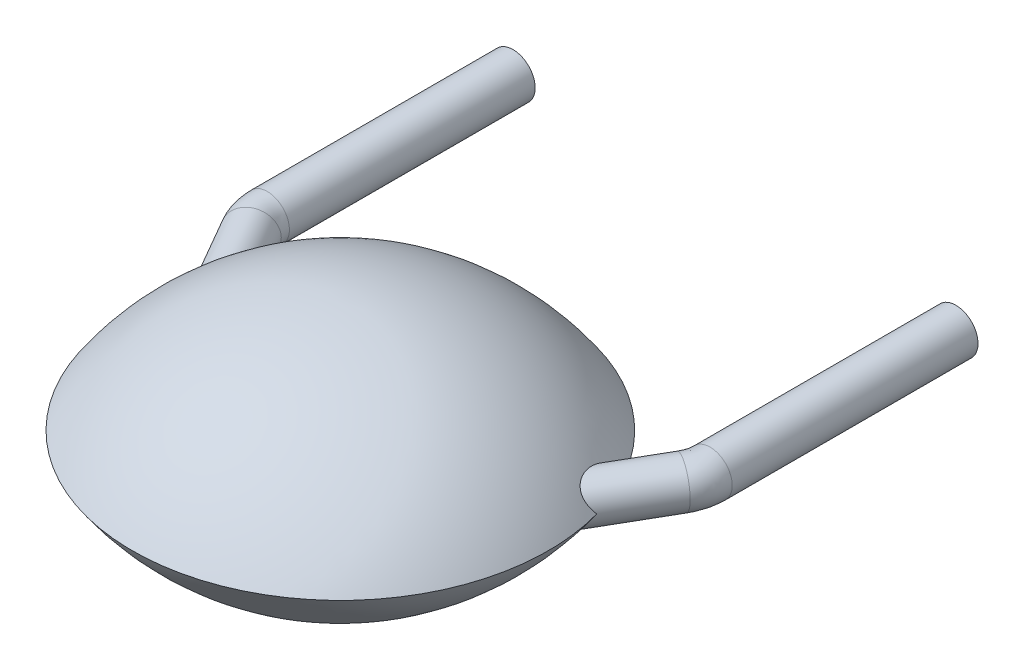
ISO-10303-21;
HEADER;
FILE_DESCRIPTION(('STEP AP214'),'2;1');
FILE_NAME('part.step','',(''),(''),'','','');
FILE_SCHEMA(('AUTOMOTIVE_DESIGN { 1 0 10303 214 1 1 1 1 }'));
ENDSEC;
DATA;
#1=APPLICATION_CONTEXT('core data for automotive mechanical design processes');
#2=APPLICATION_PROTOCOL_DEFINITION('international standard','automotive_design',2000,#1);
#3=PRODUCT_CONTEXT('',#1,'mechanical');
#4=PRODUCT('Part','Part','',(#3));
#5=PRODUCT_RELATED_PRODUCT_CATEGORY('part','',(#4));
#6=PRODUCT_DEFINITION_FORMATION('','',#4);
#7=PRODUCT_DEFINITION_CONTEXT('part definition',#1,'design');
#8=PRODUCT_DEFINITION('design','',#6,#7);
#9=PRODUCT_DEFINITION_SHAPE('','',#8);
#10=(LENGTH_UNIT() NAMED_UNIT(*) SI_UNIT(.MILLI.,.METRE.));
#11=(NAMED_UNIT(*) PLANE_ANGLE_UNIT() SI_UNIT($,.RADIAN.));
#12=(NAMED_UNIT(*) SI_UNIT($,.STERADIAN.) SOLID_ANGLE_UNIT());
#13=UNCERTAINTY_MEASURE_WITH_UNIT(LENGTH_MEASURE(1.E-05),#10,'distance_accuracy_value','');
#14=(GEOMETRIC_REPRESENTATION_CONTEXT(3) GLOBAL_UNCERTAINTY_ASSIGNED_CONTEXT((#13)) GLOBAL_UNIT_ASSIGNED_CONTEXT((#10,
#11,#12)) REPRESENTATION_CONTEXT('',''));
#15=CARTESIAN_POINT('',(0.,0.,0.));
#16=DIRECTION('',(0.,0.,1.));
#17=DIRECTION('',(1.,0.,0.));
#18=AXIS2_PLACEMENT_3D('',#15,#16,#17);
#19=CARTESIAN_POINT('',(5.,0.25,-2.));
#20=DIRECTION('',(0.,0.,-1.));
#21=DIRECTION('',(0.,-1.,0.));
#22=AXIS2_PLACEMENT_3D('',#19,#20,#21);
#23=PLANE('',#22);
#24=CARTESIAN_POINT('',(5.,0.,-2.));
#25=DIRECTION('',(0.,0.,1.));
#26=DIRECTION('',(0.,1.,0.));
#27=AXIS2_PLACEMENT_3D('',#24,#25,#26);
#28=CIRCLE('',#27,0.25);
#29=CARTESIAN_POINT('',(5.,0.25,-2.));
#30=VERTEX_POINT('',#29);
#31=EDGE_CURVE('E11',#30,#30,#28,.T.);
#32=ORIENTED_EDGE('',*,*,#31,.F.);
#33=EDGE_LOOP('',(#32));
#34=FACE_BOUND('',#33,.T.);
#35=ADVANCED_FACE('F17',(#34),#23,.T.);
#36=CARTESIAN_POINT('',(5.,0.,-2.));
#37=DIRECTION('',(0.,0.,-1.));
#38=DIRECTION('',(0.,1.,0.));
#39=AXIS2_PLACEMENT_3D('',#36,#37,#38);
#40=CYLINDRICAL_SURFACE('',#39,0.25);
#41=DIRECTION('',(0.,0.,1.));
#42=VECTOR('',#41,1.);
#43=CARTESIAN_POINT('',(5.,0.25,-2.));
#44=LINE('',#43,#42);
#45=CARTESIAN_POINT('',(5.,0.25,0.775));
#46=VERTEX_POINT('',#45);
#47=EDGE_CURVE('E30',#30,#46,#44,.T.);
#48=ORIENTED_EDGE('',*,*,#47,.T.);
#49=CARTESIAN_POINT('',(5.,0.,0.775));
#50=DIRECTION('',(0.,0.,1.));
#51=DIRECTION('',(0.,1.,0.));
#52=AXIS2_PLACEMENT_3D('',#49,#50,#51);
#53=CIRCLE('',#52,0.25);
#54=EDGE_CURVE('E131',#46,#46,#53,.T.);
#55=ORIENTED_EDGE('',*,*,#54,.F.);
#56=ORIENTED_EDGE('',*,*,#47,.F.);
#57=ORIENTED_EDGE('',*,*,#31,.T.);
#58=EDGE_LOOP('',(#48,#55,#56,#57));
#59=FACE_BOUND('',#58,.T.);
#60=ADVANCED_FACE('F144',(#59),#40,.T.);
#61=CARTESIAN_POINT('',(5.,0.25,0.775));
#62=CARTESIAN_POINT('',(4.5,0.25,0.775));
#63=CARTESIAN_POINT('',(4.5,-0.25,0.775));
#64=CARTESIAN_POINT('',(5.,-0.25,0.775));
#65=CARTESIAN_POINT('',(5.5,-0.25,0.775));
#66=CARTESIAN_POINT('',(5.5,0.25,0.775));
#67=CARTESIAN_POINT('',(5.,0.25,0.775));
#68=(BOUNDED_CURVE() B_SPLINE_CURVE(3,(#61,#62,#63,#64,#65,#66,#67),.UNSPECIFIED.,.T.,
.F.) B_SPLINE_CURVE_WITH_KNOTS((4,3,4),(0.,0.5,1.),
.UNSPECIFIED.) CURVE() GEOMETRIC_REPRESENTATION_ITEM() RATIONAL_B_SPLINE_CURVE((1.,
0.333333333333334,0.333333333333334,1.,0.333333333333334,0.333333333333334,1.)) REPRESENTATION_ITEM(''));
#69=CARTESIAN_POINT('',(4.5,-4.,0.775));
#70=DIRECTION('',(0.,1.,0.));
#71=AXIS1_PLACEMENT('',#69,#70);
#72=SURFACE_OF_REVOLUTION('',#68,#71);
#73=CARTESIAN_POINT('',(4.933012701892,0.,1.025));
#74=DIRECTION('',(-0.50000000000019,0.,0.866025403784329));
#75=DIRECTION('',(0.,1.,0.));
#76=AXIS2_PLACEMENT_3D('',#73,#74,#75);
#77=CIRCLE('',#76,0.25);
#78=CARTESIAN_POINT('',(4.933012701892,0.25,1.025));
#79=VERTEX_POINT('',#78);
#80=EDGE_CURVE('E95',#79,#79,#77,.T.);
#81=ORIENTED_EDGE('',*,*,#80,.F.);
#82=CARTESIAN_POINT('',(4.5,0.25,0.775));
#83=DIRECTION('',(0.,-1.,0.));
#84=DIRECTION('',(1.,0.,0.));
#85=AXIS2_PLACEMENT_3D('',#82,#83,#84);
#86=CIRCLE('',#85,0.5);
#87=EDGE_CURVE('E81',#46,#79,#86,.T.);
#88=ORIENTED_EDGE('',*,*,#87,.F.);
#89=ORIENTED_EDGE('',*,*,#54,.T.);
#90=ORIENTED_EDGE('',*,*,#87,.T.);
#91=EDGE_LOOP('',(#81,#88,#89,#90));
#92=FACE_BOUND('',#91,.T.);
#93=ADVANCED_FACE('F141',(#92),#72,.T.);
#94=CARTESIAN_POINT('',(4.933012701892,0.,1.025));
#95=DIRECTION('',(0.50000000000019,0.,-0.866025403784329));
#96=DIRECTION('',(0.,1.,0.));
#97=AXIS2_PLACEMENT_3D('',#94,#95,#96);
#98=CYLINDRICAL_SURFACE('',#97,0.25);
#99=DIRECTION('',(-0.50000000000019,0.,0.866025403784329));
#100=VECTOR('',#99,1.);
#101=CARTESIAN_POINT('',(4.933012701892,0.25,1.025));
#102=LINE('',#101,#100);
#103=CARTESIAN_POINT('',(4.532826728714,0.25,1.718142438021));
#104=VERTEX_POINT('',#103);
#105=EDGE_CURVE('E88',#79,#104,#102,.T.);
#106=ORIENTED_EDGE('',*,*,#105,.T.);
#107=CARTESIAN_POINT('',(4.763560706927,0.,1.818499464723));
#108=CARTESIAN_POINT('',(4.758844703415,0.009995759153714,1.826667822415));
#109=CARTESIAN_POINT('',(4.753745777499,0.02029241954503,1.834567255101));
#110=CARTESIAN_POINT('',(4.748218069065,0.03093869308417,1.842173458271));
#111=CARTESIAN_POINT('',(4.742211778879,0.04197673965895,1.849438090783));
#112=CARTESIAN_POINT('',(4.735655005178,0.05345946217219,1.856272463061));
#113=CARTESIAN_POINT('',(4.728476240283,0.06543144476252,1.862566267693));
#114=CARTESIAN_POINT('',(4.714810586219,0.087011978907,1.872057241007));
#115=CARTESIAN_POINT('',(4.70887624491,0.09606089332394,1.875515448437));
#116=CARTESIAN_POINT('',(4.702694667026,0.105155622696,1.87841980067));
#117=CARTESIAN_POINT('',(4.696269388685,0.114269879296,1.880707210424));
#118=CARTESIAN_POINT('',(4.689611849569,0.123366325353,1.882310764799));
#119=CARTESIAN_POINT('',(4.682741392925,0.132396573053,1.883159725271));
#120=CARTESIAN_POINT('',(4.670395962334,0.147976119376,1.883194371676));
#121=CARTESIAN_POINT('',(4.665001245232,0.15458294826,1.88274661822));
#122=CARTESIAN_POINT('',(4.659519533538,0.161087716182,1.881804169931));
#123=CARTESIAN_POINT('',(4.653972260908,0.1674562584,1.880344778982));
#124=CARTESIAN_POINT('',(4.648383875375,0.173654200442,1.878356047114));
#125=CARTESIAN_POINT('',(4.64278183935,0.179646958106,1.875835425634));
#126=CARTESIAN_POINT('',(4.627890586084,0.194984984515,1.867716304104));
#127=CARTESIAN_POINT('',(4.618614588771,0.203922214517,1.861180431983));
#128=CARTESIAN_POINT('',(4.609568615872,0.211995093269,1.853264008463));
#129=CARTESIAN_POINT('',(4.60084996767,0.219143633723,1.844131839367));
#130=CARTESIAN_POINT('',(4.592520747209,0.225359928766,1.833980348145));
#131=CARTESIAN_POINT('',(4.584635282419,0.230649923835,1.823019368723));
#132=CARTESIAN_POINT('',(4.568666936322,0.240158998385,1.798161125723));
#133=CARTESIAN_POINT('',(4.561197517168,0.243813148265,1.784777357412));
#134=CARTESIAN_POINT('',(4.554464491902,0.246482454188,1.771386204376));
#135=CARTESIAN_POINT('',(4.548359803551,0.248312189761,1.758021485543));
#136=CARTESIAN_POINT('',(4.542760995104,0.249459103551,1.74469754069));
#137=CARTESIAN_POINT('',(4.53760386122,0.249999998969,1.731411524385));
#138=CARTESIAN_POINT('',(4.532826728714,0.25,1.718142438021));
#139=(BOUNDED_CURVE() B_SPLINE_CURVE(7,(#107,#108,#109,#110,#111,#112,#113,#114,#115,#116,#117,
#118,#119,#120,#121,#122,#123,#124,#125,#126,#127,#128,#129,#130,#131,#132,#133,#134,#135,#136,
#137,#138),.UNSPECIFIED.,.F.,.F.) B_SPLINE_CURVE_WITH_KNOTS((8,6,6,6,6,8),(0.,0.239786480353,
0.410931069694,0.539221785461,0.752979020064,1.),
.UNSPECIFIED.) CURVE() GEOMETRIC_REPRESENTATION_ITEM() RATIONAL_B_SPLINE_CURVE((1.,1.,1.,1.,1.,
1.,1.,1.,1.,1.,1.,1.,1.,1.,1.,1.,1.,1.,1.,1.,1.,1.,1.,1.,1.,1.,1.,1.,1.,1.,1.,1.)) REPRESENTATION_ITEM(''));
#140=CARTESIAN_POINT('',(4.763560706927,0.,1.818499464723));
#141=VERTEX_POINT('',#140);
#142=EDGE_CURVE('E93',#141,#104,#139,.T.);
#143=ORIENTED_EDGE('',*,*,#142,.F.);
#144=CARTESIAN_POINT('',(4.517429282962,0.,1.244811596369));
#145=CARTESIAN_POINT('',(4.510632966289,-0.01761240078669,1.256583162152));
#146=CARTESIAN_POINT('',(4.504659433587,-0.03493074932916,1.269824704246));
#147=CARTESIAN_POINT('',(4.499459951353,-0.05193213065922,1.284447221075));
#148=CARTESIAN_POINT('',(4.495011476014,-0.06858472684866,1.300401959441));
#149=CARTESIAN_POINT('',(4.4913054382,-0.08485033557086,1.317661500913));
#150=CARTESIAN_POINT('',(4.488345754051,-0.100684394944,1.336217620577));
#151=CARTESIAN_POINT('',(4.484205278112,-0.129707976399,1.373805404074));
#152=CARTESIAN_POINT('',(4.48286726556,-0.142985858918,1.392549104308));
#153=CARTESIAN_POINT('',(4.482156029793,-0.155838158897,1.412352452317));
#154=CARTESIAN_POINT('',(4.482101461829,-0.168212478203,1.433242001128));
#155=CARTESIAN_POINT('',(4.482750627195,-0.180031887557,1.455246729257));
#156=CARTESIAN_POINT('',(4.48416277395,-0.191199648429,1.478389967202));
#157=CARTESIAN_POINT('',(4.4883610398,-0.210304782392,1.523206866386));
#158=CARTESIAN_POINT('',(4.490887210797,-0.218449829487,1.544471957322));
#159=CARTESIAN_POINT('',(4.494084475629,-0.225960057566,1.566617214765));
#160=CARTESIAN_POINT('',(4.49803621659,-0.232713500775,1.589660789446));
#161=CARTESIAN_POINT('',(4.502844058279,-0.238526216003,1.613545575133));
#162=CARTESIAN_POINT('',(4.508614763191,-0.243174485289,1.638124763665));
#163=CARTESIAN_POINT('',(4.521887334827,-0.249321549488,1.686423177021));
#164=CARTESIAN_POINT('',(4.529280810153,-0.251045001775,1.710246010555));
#165=CARTESIAN_POINT('',(4.537714832193,-0.251213012067,1.734076685418));
#166=CARTESIAN_POINT('',(4.547178344267,-0.249567723817,1.757273565374));
#167=CARTESIAN_POINT('',(4.557597737057,-0.245960817012,1.779162370904));
#168=CARTESIAN_POINT('',(4.568814045764,-0.240364832128,1.799042062763));
#169=CARTESIAN_POINT('',(4.586943181543,-0.229037615268,1.826083693493));
#170=CARTESIAN_POINT('',(4.593582620383,-0.224447620697,1.835002514366));
#171=CARTESIAN_POINT('',(4.600326212624,-0.219363273822,1.843096095411));
#172=CARTESIAN_POINT('',(4.607137880719,-0.213825466207,1.850334439684));
#173=CARTESIAN_POINT('',(4.613979714499,-0.207882236452,1.856704586021));
#174=CARTESIAN_POINT('',(4.620811971181,-0.201588770195,1.862210609046));
#175=CARTESIAN_POINT('',(4.641642736922,-0.181371564435,1.876534835428));
#176=CARTESIAN_POINT('',(4.654837988848,-0.167115645301,1.8821402897));
#177=CARTESIAN_POINT('',(4.667138492972,-0.152705788376,1.884659383432));
#178=CARTESIAN_POINT('',(4.678531788619,-0.138415494516,1.884783236523));
#179=CARTESIAN_POINT('',(4.689101709418,-0.124359447384,1.883081908431));
#180=CARTESIAN_POINT('',(4.699000160986,-0.110468998161,1.879881788207));
#181=CARTESIAN_POINT('',(4.717946982984,-0.08238395769578,1.870566401279));
#182=CARTESIAN_POINT('',(4.726854459616,-0.06838291622828,1.864487860834));
#183=CARTESIAN_POINT('',(4.735209453302,-0.05448912839595,1.857227146931));
#184=CARTESIAN_POINT('',(4.743042792413,-0.04070323100233,1.848917365587));
#185=CARTESIAN_POINT('',(4.750372628375,-0.02702628232881,1.839650884785));
#186=CARTESIAN_POINT('',(4.757210896059,-0.01345867956638,1.829497659765));
#187=CARTESIAN_POINT('',(4.763560706927,0.,1.818499464723));
#188=(BOUNDED_CURVE() B_SPLINE_CURVE(7,(#144,#145,#146,#147,#148,#149,#150,#151,#152,#153,#154,
#155,#156,#157,#158,#159,#160,#161,#162,#163,#164,#165,#166,#167,#168,#169,#170,#171,#172,#173,
#174,#175,#176,#177,#178,#179,#180,#181,#182,#183,#184,#185,#186,#187),.UNSPECIFIED.,.F.,
.F.) B_SPLINE_CURVE_WITH_KNOTS((8,6,6,6,6,6,6,8),(0.,0.187238172592,0.354047818737,
0.494281010657,0.62438687267,0.697126513933,0.847834616067,1.),
.UNSPECIFIED.) CURVE() GEOMETRIC_REPRESENTATION_ITEM() RATIONAL_B_SPLINE_CURVE((1.,1.,1.,1.,1.,
1.,1.,1.,1.,1.,1.,1.,1.,1.,1.,1.,1.,1.,1.,1.,1.,1.,1.,1.,1.,1.,1.,1.,1.,1.,1.,1.,1.,1.,1.,1.,1.,
1.,1.,1.,1.,1.,1.,1.)) REPRESENTATION_ITEM(''));
#189=CARTESIAN_POINT('',(4.517429282962,0.,1.244811596369));
#190=VERTEX_POINT('',#189);
#191=EDGE_CURVE('E100',#190,#141,#188,.T.);
#192=ORIENTED_EDGE('',*,*,#191,.F.);
#193=CARTESIAN_POINT('',(4.532826728714,0.25,1.718142438021));
#194=CARTESIAN_POINT('',(4.527636768783,0.24999999888,1.70372666726));
#195=CARTESIAN_POINT('',(4.522634027717,0.249373968694,1.688628684794));
#196=CARTESIAN_POINT('',(4.517829987641,0.248088273658,1.672844639216));
#197=CARTESIAN_POINT('',(4.513241654207,0.246102612506,1.65637574594));
#198=CARTESIAN_POINT('',(4.508891575235,0.243370114291,1.639229163219));
#199=CARTESIAN_POINT('',(4.504807484426,0.23983913745,1.621419886524));
#200=CARTESIAN_POINT('',(4.501022581494,0.235452540651,1.602969332456));
#201=CARTESIAN_POINT('',(4.493551945714,0.223932886496,1.561610034971));
#202=CARTESIAN_POINT('',(4.48995599679,0.216408489268,1.538283376505));
#203=CARTESIAN_POINT('',(4.486902179849,0.2074701704,1.514109904727));
#204=CARTESIAN_POINT('',(4.484512991877,0.197063910406,1.489384684104));
#205=CARTESIAN_POINT('',(4.482901327764,0.185213570746,1.464501266901));
#206=CARTESIAN_POINT('',(4.482158826182,0.17205018336,1.439947036512));
#207=CARTESIAN_POINT('',(4.482321110555,0.157874440003,1.41630146626));
#208=CARTESIAN_POINT('',(4.484461797247,0.125282266103,1.36699983092));
#209=CARTESIAN_POINT('',(4.48685218643,0.106739065736,1.342308319522));
#210=CARTESIAN_POINT('',(4.490271584856,0.08807870358415,1.320292497956));
#211=CARTESIAN_POINT('',(4.494533156687,0.06960115177301,1.30084806752));
#212=CARTESIAN_POINT('',(4.499479421957,0.05150000819688,1.283800101463));
#213=CARTESIAN_POINT('',(4.504985561808,0.03387110118537,1.268921957179));
#214=CARTESIAN_POINT('',(4.510975621687,0.01672442212241,1.255989665593));
#215=CARTESIAN_POINT('',(4.517429282962,0.,1.244811596369));
#216=(BOUNDED_CURVE() B_SPLINE_CURVE(8,(#193,#194,#195,#196,#197,#198,#199,#200,#201,#202,#203,
#204,#205,#206,#207,#208,#209,#210,#211,#212,#213,#214,#215),.UNSPECIFIED.,.F.,
.F.) B_SPLINE_CURVE_WITH_KNOTS((9,7,7,9),(0.,0.276897458872,0.600443291508,1.),
.UNSPECIFIED.) CURVE() GEOMETRIC_REPRESENTATION_ITEM() RATIONAL_B_SPLINE_CURVE((1.,1.,1.,1.,1.,
1.,1.,1.,1.,1.,1.,1.,1.,1.,1.,1.,1.,1.,1.,1.,1.,1.,1.)) REPRESENTATION_ITEM(''));
#217=EDGE_CURVE('E97',#104,#190,#216,.T.);
#218=ORIENTED_EDGE('',*,*,#217,.F.);
#219=ORIENTED_EDGE('',*,*,#105,.F.);
#220=ORIENTED_EDGE('',*,*,#80,.T.);
#221=EDGE_LOOP('',(#106,#143,#192,#218,#219,#220));
#222=FACE_BOUND('',#221,.T.);
#223=ADVANCED_FACE('F90',(#222),#98,.T.);
#224=CARTESIAN_POINT('',(2.5,-1.584,2.45));
#225=DIRECTION('',(0.,-1.,0.));
#226=DIRECTION('',(-1.,0.,0.));
#227=AXIS2_PLACEMENT_3D('',#224,#225,#226);
#228=SPHERICAL_SURFACE('',#227,2.834);
#229=CARTESIAN_POINT('',(2.5,-1.584,2.45));
#230=DIRECTION('',(0.,0.,1.));
#231=DIRECTION('',(0.,1.,0.));
#232=AXIS2_PLACEMENT_3D('',#229,#230,#231);
#233=CIRCLE('',#232,2.834);
#234=CARTESIAN_POINT('',(2.5,1.25,2.45));
#235=VERTEX_POINT('',#234);
#236=CARTESIAN_POINT('',(0.15,0.,2.45));
#237=VERTEX_POINT('',#236);
#238=EDGE_CURVE('E109',#235,#237,#233,.T.);
#239=ORIENTED_EDGE('',*,*,#238,.F.);
#240=ORIENTED_EDGE('',*,*,#238,.T.);
#241=CARTESIAN_POINT('',(2.5,0.,2.45));
#242=DIRECTION('',(0.,-1.,0.));
#243=DIRECTION('',(-1.,0.,0.));
#244=AXIS2_PLACEMENT_3D('',#241,#242,#243);
#245=CIRCLE('',#244,2.35);
#246=EDGE_CURVE('E107',#141,#237,#245,.T.);
#247=ORIENTED_EDGE('',*,*,#246,.F.);
#248=ORIENTED_EDGE('',*,*,#142,.T.);
#249=ORIENTED_EDGE('',*,*,#217,.T.);
#250=CARTESIAN_POINT('',(2.5,0.,2.45));
#251=DIRECTION('',(0.,-1.,0.));
#252=DIRECTION('',(-1.,0.,0.));
#253=AXIS2_PLACEMENT_3D('',#250,#251,#252);
#254=CIRCLE('',#253,2.35);
#255=CARTESIAN_POINT('',(0.482570717038,0.,1.244811596369));
#256=VERTEX_POINT('',#255);
#257=EDGE_CURVE('E230',#256,#190,#254,.T.);
#258=ORIENTED_EDGE('',*,*,#257,.F.);
#259=CARTESIAN_POINT('',(0.482570717038,0.,1.244811596369));
#260=CARTESIAN_POINT('',(0.489367033711,0.01761240078772,1.256583162152));
#261=CARTESIAN_POINT('',(0.495340566414,0.03493074933117,1.269824704248));
#262=CARTESIAN_POINT('',(0.500540048648,0.0519321306622,1.284447221077));
#263=CARTESIAN_POINT('',(0.504988523987,0.06858472685255,1.300401959444));
#264=CARTESIAN_POINT('',(0.508694561801,0.08485033557559,1.317661500918));
#265=CARTESIAN_POINT('',(0.51165424595,0.10068439495,1.336217620584));
#266=CARTESIAN_POINT('',(0.515794721889,0.129707976404,1.373805404082));
#267=CARTESIAN_POINT('',(0.51713273444,0.142985858923,1.392549104316));
#268=CARTESIAN_POINT('',(0.517843970207,0.155838158901,1.412352452325));
#269=CARTESIAN_POINT('',(0.517898538171,0.168212478207,1.433242001136));
#270=CARTESIAN_POINT('',(0.517249372805,0.180031887561,1.455246729264));
#271=CARTESIAN_POINT('',(0.515837226049,0.191199648432,1.47838996721));
#272=CARTESIAN_POINT('',(0.511638960199,0.210304782395,1.523206866394));
#273=CARTESIAN_POINT('',(0.509112789202,0.21844982949,1.544471957331));
#274=CARTESIAN_POINT('',(0.505915524369,0.225960057569,1.566617214775));
#275=CARTESIAN_POINT('',(0.501963783408,0.232713500778,1.589660789456));
#276=CARTESIAN_POINT('',(0.497155941719,0.238526216006,1.613545575144));
#277=CARTESIAN_POINT('',(0.491385236806,0.243174485291,1.638124763677));
#278=CARTESIAN_POINT('',(0.478112665169,0.249321549489,1.686423177035));
#279=CARTESIAN_POINT('',(0.470719189842,0.251045001776,1.710246010569));
#280=CARTESIAN_POINT('',(0.462285167802,0.251213012067,1.734076685433));
#281=CARTESIAN_POINT('',(0.452821655726,0.249567723815,1.757273565388));
#282=CARTESIAN_POINT('',(0.442402262937,0.245960817009,1.779162370917));
#283=CARTESIAN_POINT('',(0.431185954229,0.240364832125,1.799042062776));
#284=CARTESIAN_POINT('',(0.413056818449,0.229037615263,1.826083693504));
#285=CARTESIAN_POINT('',(0.406417379609,0.224447620691,1.835002514376));
#286=CARTESIAN_POINT('',(0.399673787367,0.219363273816,1.843096095421));
#287=CARTESIAN_POINT('',(0.392862119273,0.2138254662,1.850334439693));
#288=CARTESIAN_POINT('',(0.386020285492,0.207882236445,1.856704586029));
#289=CARTESIAN_POINT('',(0.37918802881,0.201588770187,1.862210609053));
#290=CARTESIAN_POINT('',(0.358357263069,0.181371564426,1.876534835432));
#291=CARTESIAN_POINT('',(0.345162011143,0.167115645291,1.882140289703));
#292=CARTESIAN_POINT('',(0.33286150702,0.152705788366,1.884659383433));
#293=CARTESIAN_POINT('',(0.321468211374,0.138415494507,1.884783236523));
#294=CARTESIAN_POINT('',(0.310898290575,0.124359447374,1.88308190843));
#295=CARTESIAN_POINT('',(0.300999839007,0.110468998151,1.879881788204));
#296=CARTESIAN_POINT('',(0.28205301701,0.08238395768711,1.870566401275));
#297=CARTESIAN_POINT('',(0.27314554038,0.06838291622111,1.86448786083));
#298=CARTESIAN_POINT('',(0.264790546694,0.05448912839026,1.857227146928));
#299=CARTESIAN_POINT('',(0.256957207585,0.0407032309981,1.848917365584));
#300=CARTESIAN_POINT('',(0.249627371623,0.02702628232601,1.839650884783));
#301=CARTESIAN_POINT('',(0.24278910394,0.01345867956499,1.829497659764));
#302=CARTESIAN_POINT('',(0.236439293073,0.,1.818499464723));
#303=(BOUNDED_CURVE() B_SPLINE_CURVE(7,(#259,#260,#261,#262,#263,#264,#265,#266,#267,#268,#269,
#270,#271,#272,#273,#274,#275,#276,#277,#278,#279,#280,#281,#282,#283,#284,#285,#286,#287,#288,
#289,#290,#291,#292,#293,#294,#295,#296,#297,#298,#299,#300,#301,#302),.UNSPECIFIED.,.F.,
.F.) B_SPLINE_CURVE_WITH_KNOTS((8,6,6,6,6,6,6,8),(0.,0.187238172603,0.354047818744,
0.494281010668,0.624386872683,0.697126513947,0.847834616082,1.),
.UNSPECIFIED.) CURVE() GEOMETRIC_REPRESENTATION_ITEM() RATIONAL_B_SPLINE_CURVE((1.,1.,1.,1.,1.,
1.,1.,1.,1.,1.,1.,1.,1.,1.,1.,1.,1.,1.,1.,1.,1.,1.,1.,1.,1.,1.,1.,1.,1.,1.,1.,1.,1.,1.,1.,1.,1.,
1.,1.,1.,1.,1.,1.,1.)) REPRESENTATION_ITEM(''));
#304=CARTESIAN_POINT('',(0.236439293073,0.,1.818499464723));
#305=VERTEX_POINT('',#304);
#306=EDGE_CURVE('E193',#256,#305,#303,.T.);
#307=ORIENTED_EDGE('',*,*,#306,.T.);
#308=CARTESIAN_POINT('',(2.5,0.,2.45));
#309=DIRECTION('',(0.,-1.,0.));
#310=DIRECTION('',(-1.,0.,0.));
#311=AXIS2_PLACEMENT_3D('',#308,#309,#310);
#312=CIRCLE('',#311,2.35);
#313=EDGE_CURVE('E224',#237,#305,#312,.T.);
#314=ORIENTED_EDGE('',*,*,#313,.F.);
#315=EDGE_LOOP('',(#239,#240,#247,#248,#249,#258,#307,#314));
#316=FACE_BOUND('',#315,.T.);
#317=ADVANCED_FACE('F105',(#316),#228,.T.);
#318=CARTESIAN_POINT('',(2.5,1.584,2.45));
#319=DIRECTION('',(0.,-1.,0.));
#320=DIRECTION('',(-1.,0.,0.));
#321=AXIS2_PLACEMENT_3D('',#318,#319,#320);
#322=SPHERICAL_SURFACE('',#321,2.834);
#323=CARTESIAN_POINT('',(2.5,1.584,2.45));
#324=DIRECTION('',(0.,0.,1.));
#325=DIRECTION('',(-0.829216654904762,-0.55892731122084,0.));
#326=AXIS2_PLACEMENT_3D('',#323,#324,#325);
#327=CIRCLE('',#326,2.834);
#328=CARTESIAN_POINT('',(2.5,-1.25,2.45));
#329=VERTEX_POINT('',#328);
#330=EDGE_CURVE('E231',#237,#329,#327,.T.);
#331=ORIENTED_EDGE('',*,*,#330,.F.);
#332=ORIENTED_EDGE('',*,*,#313,.T.);
#333=CARTESIAN_POINT('',(0.236439293073,0.,1.818499464723));
#334=CARTESIAN_POINT('',(0.241155296585,-0.009995759154129,1.826667822416));
#335=CARTESIAN_POINT('',(0.246254222502,-0.02029241954585,1.834567255101));
#336=CARTESIAN_POINT('',(0.251781930935,-0.03093869308552,1.842173458272));
#337=CARTESIAN_POINT('',(0.257788221122,-0.0419767396607,1.849438090784));
#338=CARTESIAN_POINT('',(0.264344994824,-0.05345946217458,1.856272463063));
#339=CARTESIAN_POINT('',(0.271523759719,-0.06543144476545,1.862566267695));
#340=CARTESIAN_POINT('',(0.285189413782,-0.08701197890924,1.872057241008));
#341=CARTESIAN_POINT('',(0.291123755092,-0.09606089332633,1.875515448438));
#342=CARTESIAN_POINT('',(0.297305332976,-0.105155622699,1.87841980067));
#343=CARTESIAN_POINT('',(0.303730611317,-0.1142698793,1.880707210425));
#344=CARTESIAN_POINT('',(0.310388150433,-0.123366325356,1.8823107648));
#345=CARTESIAN_POINT('',(0.317258607077,-0.132396573055,1.883159725271));
#346=CARTESIAN_POINT('',(0.329604037664,-0.147976119374,1.883194371676));
#347=CARTESIAN_POINT('',(0.334998754766,-0.154582948258,1.88274661822));
#348=CARTESIAN_POINT('',(0.34048046646,-0.16108771618,1.881804169932));
#349=CARTESIAN_POINT('',(0.34602773909,-0.167456258398,1.880344778983));
#350=CARTESIAN_POINT('',(0.351616124623,-0.17365420044,1.878356047115));
#351=CARTESIAN_POINT('',(0.357218160647,-0.179646958104,1.875835425635));
#352=CARTESIAN_POINT('',(0.372109413915,-0.194984984515,1.867716304105));
#353=CARTESIAN_POINT('',(0.381385411228,-0.203922214516,1.861180431984));
#354=CARTESIAN_POINT('',(0.390431384126,-0.211995093267,1.853264008465));
#355=CARTESIAN_POINT('',(0.399150032327,-0.21914363372,1.844131839371));
#356=CARTESIAN_POINT('',(0.407479252787,-0.225359928763,1.83398034815));
#357=CARTESIAN_POINT('',(0.415364717578,-0.230649923833,1.823019368729));
#358=CARTESIAN_POINT('',(0.431333063675,-0.240158998384,1.798161125728));
#359=CARTESIAN_POINT('',(0.43880248283,-0.243813148264,1.784777357416));
#360=CARTESIAN_POINT('',(0.445535508097,-0.246482454187,1.771386204379));
#361=CARTESIAN_POINT('',(0.451640196448,-0.248312189761,1.758021485546));
#362=CARTESIAN_POINT('',(0.457239004896,-0.249459103551,1.744697540692));
#363=CARTESIAN_POINT('',(0.462396138779,-0.249999998969,1.731411524386));
#364=CARTESIAN_POINT('',(0.467173271286,-0.25,1.718142438021));
#365=(BOUNDED_CURVE() B_SPLINE_CURVE(7,(#333,#334,#335,#336,#337,#338,#339,#340,#341,#342,#343,
#344,#345,#346,#347,#348,#349,#350,#351,#352,#353,#354,#355,#356,#357,#358,#359,#360,#361,#362,
#363,#364),.UNSPECIFIED.,.F.,.F.) B_SPLINE_CURVE_WITH_KNOTS((8,6,6,6,6,8),(0.,0.239786480397,
0.410931069734,0.53922178549,0.752979020072,1.),
.UNSPECIFIED.) CURVE() GEOMETRIC_REPRESENTATION_ITEM() RATIONAL_B_SPLINE_CURVE((1.,1.,1.,1.,1.,
1.,1.,1.,1.,1.,1.,1.,1.,1.,1.,1.,1.,1.,1.,1.,1.,1.,1.,1.,1.,1.,1.,1.,1.,1.,1.,1.)) REPRESENTATION_ITEM(''));
#366=CARTESIAN_POINT('',(0.467173271286,-0.25,1.718142438021));
#367=VERTEX_POINT('',#366);
#368=EDGE_CURVE('E200',#305,#367,#365,.T.);
#369=ORIENTED_EDGE('',*,*,#368,.T.);
#370=CARTESIAN_POINT('',(0.467173271286,-0.25,1.718142438021));
#371=CARTESIAN_POINT('',(0.472363231217,-0.24999999888,1.70372666726));
#372=CARTESIAN_POINT('',(0.477365972283,-0.249373968694,1.688628684794));
#373=CARTESIAN_POINT('',(0.482170012359,-0.248088273658,1.672844639216));
#374=CARTESIAN_POINT('',(0.486758345793,-0.246102612506,1.65637574594));
#375=CARTESIAN_POINT('',(0.491108424765,-0.243370114291,1.639229163219));
#376=CARTESIAN_POINT('',(0.495192515574,-0.239839137451,1.621419886525));
#377=CARTESIAN_POINT('',(0.498977418506,-0.235452540652,1.602969332457));
#378=CARTESIAN_POINT('',(0.506448054286,-0.223932886497,1.561610034973));
#379=CARTESIAN_POINT('',(0.51004400321,-0.216408489268,1.538283376507));
#380=CARTESIAN_POINT('',(0.51309782015,-0.207470170402,1.51410990473));
#381=CARTESIAN_POINT('',(0.515487008123,-0.197063910408,1.489384684108));
#382=CARTESIAN_POINT('',(0.517098672235,-0.185213570748,1.464501266905));
#383=CARTESIAN_POINT('',(0.517841173818,-0.172050183363,1.439947036517));
#384=CARTESIAN_POINT('',(0.517678889445,-0.157874440005,1.416301466265));
#385=CARTESIAN_POINT('',(0.515538202753,-0.125282266106,1.366999830924));
#386=CARTESIAN_POINT('',(0.513147813571,-0.106739065739,1.342308319525));
#387=CARTESIAN_POINT('',(0.509728415145,-0.08807870358626,1.320292497958));
#388=CARTESIAN_POINT('',(0.505466843313,-0.06960115177471,1.300848067522));
#389=CARTESIAN_POINT('',(0.500520578044,-0.05150000819807,1.283800101464));
#390=CARTESIAN_POINT('',(0.495014438192,-0.03387110118616,1.26892195718));
#391=CARTESIAN_POINT('',(0.489024378313,-0.0167244221228,1.255989665593));
#392=CARTESIAN_POINT('',(0.482570717038,0.,1.244811596369));
#393=(BOUNDED_CURVE() B_SPLINE_CURVE(8,(#370,#371,#372,#373,#374,#375,#376,#377,#378,#379,#380,
#381,#382,#383,#384,#385,#386,#387,#388,#389,#390,#391,#392),.UNSPECIFIED.,.F.,
.F.) B_SPLINE_CURVE_WITH_KNOTS((9,7,7,9),(0.,0.27689745887,0.600443291499,1.),
.UNSPECIFIED.) CURVE() GEOMETRIC_REPRESENTATION_ITEM() RATIONAL_B_SPLINE_CURVE((1.,1.,1.,1.,1.,
1.,1.,1.,1.,1.,1.,1.,1.,1.,1.,1.,1.,1.,1.,1.,1.,1.,1.)) REPRESENTATION_ITEM(''));
#394=EDGE_CURVE('E199',#367,#256,#393,.T.);
#395=ORIENTED_EDGE('',*,*,#394,.T.);
#396=ORIENTED_EDGE('',*,*,#257,.T.);
#397=ORIENTED_EDGE('',*,*,#191,.T.);
#398=ORIENTED_EDGE('',*,*,#246,.T.);
#399=ORIENTED_EDGE('',*,*,#330,.T.);
#400=EDGE_LOOP('',(#331,#332,#369,#395,#396,#397,#398,#399));
#401=FACE_BOUND('',#400,.T.);
#402=ADVANCED_FACE('F155',(#401),#322,.T.);
#403=CARTESIAN_POINT('',(0.06698729810778,0.,1.025));
#404=DIRECTION('',(-0.50000000000019,0.,-0.866025403784329));
#405=DIRECTION('',(0.,-1.,0.));
#406=AXIS2_PLACEMENT_3D('',#403,#404,#405);
#407=CYLINDRICAL_SURFACE('',#406,0.25);
#408=DIRECTION('',(0.50000000000019,0.,0.866025403784329));
#409=VECTOR('',#408,1.);
#410=CARTESIAN_POINT('',(0.06698729810778,-0.25,1.025));
#411=LINE('',#410,#409);
#412=CARTESIAN_POINT('',(0.06698729810778,-0.25,1.025));
#413=VERTEX_POINT('',#412);
#414=EDGE_CURVE('E212',#413,#367,#411,.T.);
#415=ORIENTED_EDGE('',*,*,#414,.T.);
#416=ORIENTED_EDGE('',*,*,#368,.F.);
#417=ORIENTED_EDGE('',*,*,#306,.F.);
#418=ORIENTED_EDGE('',*,*,#394,.F.);
#419=ORIENTED_EDGE('',*,*,#414,.F.);
#420=CARTESIAN_POINT('',(0.06698729810778,0.,1.025));
#421=DIRECTION('',(0.50000000000019,0.,0.866025403784329));
#422=DIRECTION('',(0.,-1.,0.));
#423=AXIS2_PLACEMENT_3D('',#420,#421,#422);
#424=CIRCLE('',#423,0.25);
#425=EDGE_CURVE('E206',#413,#413,#424,.T.);
#426=ORIENTED_EDGE('',*,*,#425,.T.);
#427=EDGE_LOOP('',(#415,#416,#417,#418,#419,#426));
#428=FACE_BOUND('',#427,.T.);
#429=ADVANCED_FACE('F152',(#428),#407,.T.);
#430=CARTESIAN_POINT('',(0.,-0.25,0.775));
#431=CARTESIAN_POINT('',(0.499999999999999,-0.25,0.775));
#432=CARTESIAN_POINT('',(0.499999999999999,0.25,0.775));
#433=CARTESIAN_POINT('',(0.,0.25,0.775));
#434=CARTESIAN_POINT('',(-0.499999999999999,0.25,0.775));
#435=CARTESIAN_POINT('',(-0.499999999999999,-0.25,0.775));
#436=CARTESIAN_POINT('',(0.,-0.25,0.775));
#437=(BOUNDED_CURVE() B_SPLINE_CURVE(3,(#430,#431,#432,#433,#434,#435,#436),.UNSPECIFIED.,.T.,
.F.) B_SPLINE_CURVE_WITH_KNOTS((4,3,4),(0.,0.5,1.),
.UNSPECIFIED.) CURVE() GEOMETRIC_REPRESENTATION_ITEM() RATIONAL_B_SPLINE_CURVE((1.,
0.333333333333334,0.333333333333334,1.,0.333333333333334,0.333333333333334,1.)) REPRESENTATION_ITEM(''));
#438=CARTESIAN_POINT('',(0.5,4.,0.775));
#439=DIRECTION('',(0.,-1.,0.));
#440=AXIS1_PLACEMENT('',#438,#439);
#441=SURFACE_OF_REVOLUTION('',#437,#440);
#442=ORIENTED_EDGE('',*,*,#425,.F.);
#443=CARTESIAN_POINT('',(0.5,-0.25,0.775));
#444=DIRECTION('',(0.,1.,0.));
#445=DIRECTION('',(-1.,0.,0.));
#446=AXIS2_PLACEMENT_3D('',#443,#444,#445);
#447=CIRCLE('',#446,0.5);
#448=CARTESIAN_POINT('',(0.,-0.25,0.775));
#449=VERTEX_POINT('',#448);
#450=EDGE_CURVE('E211',#449,#413,#447,.T.);
#451=ORIENTED_EDGE('',*,*,#450,.F.);
#452=CARTESIAN_POINT('',(0.,0.,0.775));
#453=DIRECTION('',(0.,0.,1.));
#454=DIRECTION('',(0.,-1.,0.));
#455=AXIS2_PLACEMENT_3D('',#452,#453,#454);
#456=CIRCLE('',#455,0.25);
#457=EDGE_CURVE('E187',#449,#449,#456,.T.);
#458=ORIENTED_EDGE('',*,*,#457,.T.);
#459=ORIENTED_EDGE('',*,*,#450,.T.);
#460=EDGE_LOOP('',(#442,#451,#458,#459));
#461=FACE_BOUND('',#460,.T.);
#462=ADVANCED_FACE('F19',(#461),#441,.T.);
#463=CARTESIAN_POINT('',(0.,0.,-2.));
#464=DIRECTION('',(0.,0.,-1.));
#465=DIRECTION('',(0.,-1.,0.));
#466=AXIS2_PLACEMENT_3D('',#463,#464,#465);
#467=CYLINDRICAL_SURFACE('',#466,0.25);
#468=DIRECTION('',(0.,0.,1.));
#469=VECTOR('',#468,1.);
#470=CARTESIAN_POINT('',(0.,-0.25,-2.));
#471=LINE('',#470,#469);
#472=CARTESIAN_POINT('',(0.,-0.25,-2.));
#473=VERTEX_POINT('',#472);
#474=EDGE_CURVE('E182',#473,#449,#471,.T.);
#475=ORIENTED_EDGE('',*,*,#474,.T.);
#476=ORIENTED_EDGE('',*,*,#457,.F.);
#477=ORIENTED_EDGE('',*,*,#474,.F.);
#478=CARTESIAN_POINT('',(0.,0.,-2.));
#479=DIRECTION('',(0.,0.,1.));
#480=DIRECTION('',(0.,-1.,0.));
#481=AXIS2_PLACEMENT_3D('',#478,#479,#480);
#482=CIRCLE('',#481,0.25);
#483=EDGE_CURVE('E175',#473,#473,#482,.T.);
#484=ORIENTED_EDGE('',*,*,#483,.T.);
#485=EDGE_LOOP('',(#475,#476,#477,#484));
#486=FACE_BOUND('',#485,.T.);
#487=ADVANCED_FACE('F159',(#486),#467,.T.);
#488=CARTESIAN_POINT('',(0.,-0.25,-2.));
#489=DIRECTION('',(0.,0.,-1.));
#490=DIRECTION('',(0.,-1.,0.));
#491=AXIS2_PLACEMENT_3D('',#488,#489,#490);
#492=PLANE('',#491);
#493=ORIENTED_EDGE('',*,*,#483,.F.);
#494=EDGE_LOOP('',(#493));
#495=FACE_BOUND('',#494,.T.);
#496=ADVANCED_FACE('F162',(#495),#492,.T.);
#497=CLOSED_SHELL('',(#35,#60,#93,#223,#317,#402,#429,#462,#487,#496));
#498=MANIFOLD_SOLID_BREP('B1',#497);
#499=ADVANCED_BREP_SHAPE_REPRESENTATION('',(#18,#498),#14);
#500=SHAPE_DEFINITION_REPRESENTATION(#9,#499);
ENDSEC;
END-ISO-10303-21;
